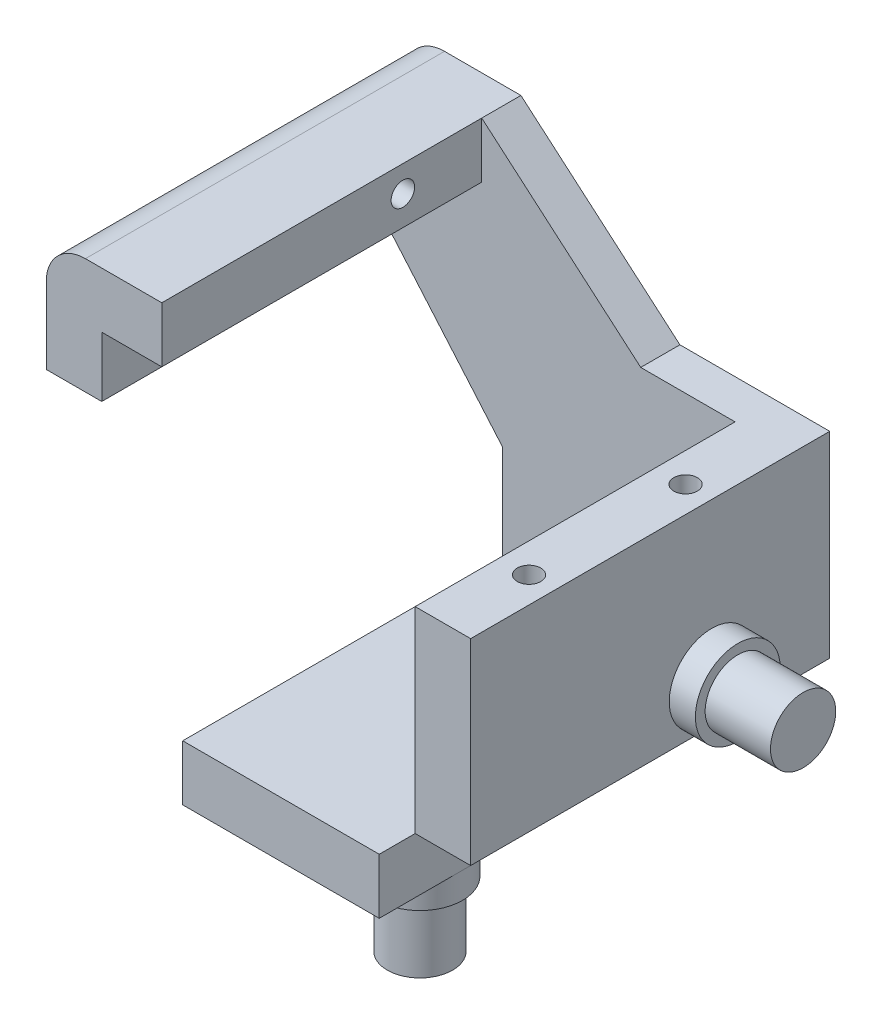
ISO-10303-21;
HEADER;
FILE_DESCRIPTION(('STEP AP214'),'2;1');
FILE_NAME('part.step','',(''),(''),'','','');
FILE_SCHEMA(('AUTOMOTIVE_DESIGN { 1 0 10303 214 1 1 1 1 }'));
ENDSEC;
DATA;
#1=APPLICATION_CONTEXT('core data for automotive mechanical design processes');
#2=APPLICATION_PROTOCOL_DEFINITION('international standard','automotive_design',2000,#1);
#3=PRODUCT_CONTEXT('',#1,'mechanical');
#4=PRODUCT('Part','Part','',(#3));
#5=PRODUCT_RELATED_PRODUCT_CATEGORY('part','',(#4));
#6=PRODUCT_DEFINITION_FORMATION('','',#4);
#7=PRODUCT_DEFINITION_CONTEXT('part definition',#1,'design');
#8=PRODUCT_DEFINITION('design','',#6,#7);
#9=PRODUCT_DEFINITION_SHAPE('','',#8);
#10=(LENGTH_UNIT() NAMED_UNIT(*) SI_UNIT(.MILLI.,.METRE.));
#11=(NAMED_UNIT(*) PLANE_ANGLE_UNIT() SI_UNIT($,.RADIAN.));
#12=(NAMED_UNIT(*) SI_UNIT($,.STERADIAN.) SOLID_ANGLE_UNIT());
#13=UNCERTAINTY_MEASURE_WITH_UNIT(LENGTH_MEASURE(1.E-05),#10,'distance_accuracy_value','');
#14=(GEOMETRIC_REPRESENTATION_CONTEXT(3) GLOBAL_UNCERTAINTY_ASSIGNED_CONTEXT((#13)) GLOBAL_UNIT_ASSIGNED_CONTEXT((#10,
#11,#12)) REPRESENTATION_CONTEXT('',''));
#15=CARTESIAN_POINT('',(0.,0.,0.));
#16=DIRECTION('',(0.,0.,1.));
#17=DIRECTION('',(1.,0.,0.));
#18=AXIS2_PLACEMENT_3D('',#15,#16,#17);
#19=CARTESIAN_POINT('',(-16.25,-16.25,27.5));
#20=DIRECTION('',(1.,0.,0.));
#21=DIRECTION('',(0.,0.,-1.));
#22=AXIS2_PLACEMENT_3D('',#19,#20,#21);
#23=PLANE('',#22);
#24=DIRECTION('',(0.,0.,1.));
#25=VECTOR('',#24,1.);
#26=CARTESIAN_POINT('',(-16.25,7.4,0.));
#27=LINE('',#26,#25);
#28=CARTESIAN_POINT('',(-16.25,7.4,0.));
#29=VERTEX_POINT('',#28);
#30=CARTESIAN_POINT('',(-16.25,7.4,3.));
#31=VERTEX_POINT('',#30);
#32=EDGE_CURVE('E167',#29,#31,#27,.T.);
#33=ORIENTED_EDGE('',*,*,#32,.T.);
#34=DIRECTION('',(0.,0.,1.));
#35=VECTOR('',#34,1.);
#36=CARTESIAN_POINT('',(-16.25,7.4,3.));
#37=LINE('',#36,#35);
#38=CARTESIAN_POINT('',(-16.25,7.4,27.5));
#39=VERTEX_POINT('',#38);
#40=EDGE_CURVE('E239',#31,#39,#37,.T.);
#41=ORIENTED_EDGE('',*,*,#40,.T.);
#42=DIRECTION('',(0.,-1.,0.));
#43=VECTOR('',#42,1.);
#44=CARTESIAN_POINT('',(-16.25,-16.25,27.5));
#45=LINE('',#44,#43);
#46=CARTESIAN_POINT('',(-16.25,13.25,27.5));
#47=VERTEX_POINT('',#46);
#48=EDGE_CURVE('E82',#47,#39,#45,.T.);
#49=ORIENTED_EDGE('',*,*,#48,.F.);
#50=DIRECTION('',(0.,0.,-1.));
#51=VECTOR('',#50,1.);
#52=CARTESIAN_POINT('',(-16.25,13.25,27.5));
#53=LINE('',#52,#51);
#54=CARTESIAN_POINT('',(-16.25,13.25,0.));
#55=VERTEX_POINT('',#54);
#56=EDGE_CURVE('E75',#47,#55,#53,.T.);
#57=ORIENTED_EDGE('',*,*,#56,.T.);
#58=DIRECTION('',(0.,-1.,0.));
#59=VECTOR('',#58,1.);
#60=CARTESIAN_POINT('',(-16.25,-16.25,0.));
#61=LINE('',#60,#59);
#62=EDGE_CURVE('E89',#55,#29,#61,.T.);
#63=ORIENTED_EDGE('',*,*,#62,.T.);
#64=EDGE_LOOP('',(#33,#41,#49,#57,#63));
#65=FACE_BOUND('',#64,.T.);
#66=ADVANCED_FACE('F34',(#65),#23,.F.);
#67=CARTESIAN_POINT('',(-16.25,-16.25,27.5));
#68=DIRECTION('',(0.,1.,0.));
#69=DIRECTION('',(0.,0.,1.));
#70=AXIS2_PLACEMENT_3D('',#67,#68,#69);
#71=PLANE('',#70);
#72=DIRECTION('',(0.,0.,1.));
#73=VECTOR('',#72,1.);
#74=CARTESIAN_POINT('',(-5.80000000000001,-16.25,3.));
#75=LINE('',#74,#73);
#76=CARTESIAN_POINT('',(-5.80000000000001,-16.25,0.));
#77=VERTEX_POINT('',#76);
#78=CARTESIAN_POINT('',(-5.80000000000001,-16.25,27.5));
#79=VERTEX_POINT('',#78);
#80=EDGE_CURVE('E228',#77,#79,#75,.T.);
#81=ORIENTED_EDGE('',*,*,#80,.F.);
#82=DIRECTION('',(1.,0.,0.));
#83=VECTOR('',#82,1.);
#84=CARTESIAN_POINT('',(-16.25,-16.25,0.));
#85=LINE('',#84,#83);
#86=CARTESIAN_POINT('',(9.25,-16.25,0.));
#87=VERTEX_POINT('',#86);
#88=EDGE_CURVE('E97',#77,#87,#85,.T.);
#89=ORIENTED_EDGE('',*,*,#88,.T.);
#90=DIRECTION('',(0.,0.,1.));
#91=VECTOR('',#90,1.);
#92=CARTESIAN_POINT('',(9.25,-16.25,0.));
#93=LINE('',#92,#91);
#94=CARTESIAN_POINT('',(9.25,-16.25,21.13));
#95=VERTEX_POINT('',#94);
#96=EDGE_CURVE('E205',#87,#95,#93,.T.);
#97=ORIENTED_EDGE('',*,*,#96,.T.);
#98=CARTESIAN_POINT('',(6.,-16.25,21.13));
#99=DIRECTION('',(0.,1.,0.));
#100=DIRECTION('',(0.,0.,1.));
#101=AXIS2_PLACEMENT_3D('',#98,#99,#100);
#102=CIRCLE('',#101,3.25);
#103=EDGE_CURVE('E113',#95,#95,#102,.F.);
#104=ORIENTED_EDGE('',*,*,#103,.F.);
#105=CARTESIAN_POINT('',(9.25,-16.25,27.5));
#106=VERTEX_POINT('',#105);
#107=EDGE_CURVE('E209',#95,#106,#93,.T.);
#108=ORIENTED_EDGE('',*,*,#107,.T.);
#109=DIRECTION('',(1.,0.,0.));
#110=VECTOR('',#109,1.);
#111=CARTESIAN_POINT('',(-16.25,-16.25,27.5));
#112=LINE('',#111,#110);
#113=EDGE_CURVE('E287',#79,#106,#112,.T.);
#114=ORIENTED_EDGE('',*,*,#113,.F.);
#115=EDGE_LOOP('',(#81,#89,#97,#104,#108,#114));
#116=FACE_BOUND('',#115,.T.);
#117=ADVANCED_FACE('F423',(#116),#71,.F.);
#118=CARTESIAN_POINT('',(-13.25,13.25,0.));
#119=DIRECTION('',(0.,0.,1.));
#120=DIRECTION('',(1.,0.,0.));
#121=AXIS2_PLACEMENT_3D('',#118,#119,#120);
#122=PLANE('',#121);
#123=DIRECTION('',(0.651281240201258,-0.758836442299598,0.));
#124=VECTOR('',#123,1.);
#125=CARTESIAN_POINT('',(-5.8,-4.77575500805203,0.));
#126=LINE('',#125,#124);
#127=CARTESIAN_POINT('',(-5.8,-4.77575500805203,0.));
#128=VERTEX_POINT('',#127);
#129=EDGE_CURVE('E96',#29,#128,#126,.T.);
#130=ORIENTED_EDGE('',*,*,#129,.F.);
#131=ORIENTED_EDGE('',*,*,#62,.F.);
#132=CARTESIAN_POINT('',(-13.25,13.25,0.));
#133=DIRECTION('',(0.,0.,1.));
#134=DIRECTION('',(1.,0.,0.));
#135=AXIS2_PLACEMENT_3D('',#132,#133,#134);
#136=CIRCLE('',#135,3.);
#137=CARTESIAN_POINT('',(-13.25,16.25,0.));
#138=VERTEX_POINT('',#137);
#139=EDGE_CURVE('E72',#138,#55,#136,.T.);
#140=ORIENTED_EDGE('',*,*,#139,.F.);
#141=DIRECTION('',(-1.,0.,0.));
#142=VECTOR('',#141,1.);
#143=CARTESIAN_POINT('',(-13.25,16.25,0.));
#144=LINE('',#143,#142);
#145=CARTESIAN_POINT('',(-7.4,16.25,0.));
#146=VERTEX_POINT('',#145);
#147=EDGE_CURVE('E83',#146,#138,#144,.T.);
#148=ORIENTED_EDGE('',*,*,#147,.F.);
#149=DIRECTION('',(0.758836442299598,-0.651281240201258,0.));
#150=VECTOR('',#149,1.);
#151=CARTESIAN_POINT('',(4.77575500805203,5.8,0.));
#152=LINE('',#151,#150);
#153=CARTESIAN_POINT('',(4.77575500805203,5.8,0.));
#154=VERTEX_POINT('',#153);
#155=EDGE_CURVE('E172',#146,#154,#152,.T.);
#156=ORIENTED_EDGE('',*,*,#155,.T.);
#157=DIRECTION('',(1.,0.,0.));
#158=VECTOR('',#157,1.);
#159=CARTESIAN_POINT('',(16.25,5.8,0.));
#160=LINE('',#159,#158);
#161=CARTESIAN_POINT('',(16.25,5.8,0.));
#162=VERTEX_POINT('',#161);
#163=EDGE_CURVE('E175',#154,#162,#160,.T.);
#164=ORIENTED_EDGE('',*,*,#163,.T.);
#165=DIRECTION('',(0.,1.,0.));
#166=VECTOR('',#165,1.);
#167=CARTESIAN_POINT('',(16.25,-16.25,0.));
#168=LINE('',#167,#166);
#169=CARTESIAN_POINT('',(16.25,-9.25,0.));
#170=VERTEX_POINT('',#169);
#171=EDGE_CURVE('E101',#170,#162,#168,.T.);
#172=ORIENTED_EDGE('',*,*,#171,.F.);
#173=DIRECTION('',(-1.,0.,0.));
#174=VECTOR('',#173,1.);
#175=CARTESIAN_POINT('',(16.25,-9.25,0.));
#176=LINE('',#175,#174);
#177=CARTESIAN_POINT('',(12.,-9.25,0.));
#178=VERTEX_POINT('',#177);
#179=EDGE_CURVE('E190',#170,#178,#176,.T.);
#180=ORIENTED_EDGE('',*,*,#179,.T.);
#181=CARTESIAN_POINT('',(12.,-12.,0.));
#182=DIRECTION('',(0.,0.,1.));
#183=DIRECTION('',(1.,0.,0.));
#184=AXIS2_PLACEMENT_3D('',#181,#182,#183);
#185=CIRCLE('',#184,2.75);
#186=CARTESIAN_POINT('',(9.25,-12.,0.));
#187=VERTEX_POINT('',#186);
#188=EDGE_CURVE('E193',#178,#187,#185,.T.);
#189=ORIENTED_EDGE('',*,*,#188,.T.);
#190=DIRECTION('',(0.,-1.,0.));
#191=VECTOR('',#190,1.);
#192=CARTESIAN_POINT('',(9.25,-16.25,0.));
#193=LINE('',#192,#191);
#194=EDGE_CURVE('E197',#187,#87,#193,.T.);
#195=ORIENTED_EDGE('',*,*,#194,.T.);
#196=ORIENTED_EDGE('',*,*,#88,.F.);
#197=DIRECTION('',(0.,-1.,0.));
#198=VECTOR('',#197,1.);
#199=CARTESIAN_POINT('',(-5.80000000000001,-16.25,0.));
#200=LINE('',#199,#198);
#201=EDGE_CURVE('E157',#128,#77,#200,.T.);
#202=ORIENTED_EDGE('',*,*,#201,.F.);
#203=EDGE_LOOP('',(#130,#131,#140,#148,#156,#164,#172,#180,#189,#195,#196,#202));
#204=FACE_BOUND('',#203,.T.);
#205=ADVANCED_FACE('F93',(#204),#122,.F.);
#206=CARTESIAN_POINT('',(0.,0.,3.));
#207=DIRECTION('',(0.,0.,-1.));
#208=DIRECTION('',(-1.,0.,0.));
#209=AXIS2_PLACEMENT_3D('',#206,#207,#208);
#210=PLANE('',#209);
#211=DIRECTION('',(0.651281240201258,-0.758836442299598,0.));
#212=VECTOR('',#211,1.);
#213=CARTESIAN_POINT('',(-5.8,-4.77575500805203,3.));
#214=LINE('',#213,#212);
#215=CARTESIAN_POINT('',(-5.8,-4.77575500805203,3.));
#216=VERTEX_POINT('',#215);
#217=EDGE_CURVE('E160',#31,#216,#214,.T.);
#218=ORIENTED_EDGE('',*,*,#217,.T.);
#219=DIRECTION('',(0.,-1.,0.));
#220=VECTOR('',#219,1.);
#221=CARTESIAN_POINT('',(-5.80000000000001,-16.25,3.));
#222=LINE('',#221,#220);
#223=CARTESIAN_POINT('',(-5.80000000000001,-12.,3.));
#224=VERTEX_POINT('',#223);
#225=EDGE_CURVE('E148',#216,#224,#222,.T.);
#226=ORIENTED_EDGE('',*,*,#225,.T.);
#227=DIRECTION('',(1.,0.,0.));
#228=VECTOR('',#227,1.);
#229=CARTESIAN_POINT('',(-12.,-12.,3.));
#230=LINE('',#229,#228);
#231=CARTESIAN_POINT('',(9.25,-12.,3.));
#232=VERTEX_POINT('',#231);
#233=EDGE_CURVE('E269',#224,#232,#230,.T.);
#234=ORIENTED_EDGE('',*,*,#233,.T.);
#235=CARTESIAN_POINT('',(12.,-12.,3.));
#236=DIRECTION('',(0.,0.,-1.));
#237=DIRECTION('',(-1.,0.,0.));
#238=AXIS2_PLACEMENT_3D('',#235,#236,#237);
#239=CIRCLE('',#238,2.75);
#240=CARTESIAN_POINT('',(12.,-9.25,3.));
#241=VERTEX_POINT('',#240);
#242=EDGE_CURVE('E37',#232,#241,#239,.T.);
#243=ORIENTED_EDGE('',*,*,#242,.T.);
#244=DIRECTION('',(0.,1.,0.));
#245=VECTOR('',#244,1.);
#246=CARTESIAN_POINT('',(12.,-12.,3.));
#247=LINE('',#246,#245);
#248=CARTESIAN_POINT('',(12.,5.8,3.));
#249=VERTEX_POINT('',#248);
#250=EDGE_CURVE('E272',#241,#249,#247,.T.);
#251=ORIENTED_EDGE('',*,*,#250,.T.);
#252=DIRECTION('',(1.,0.,0.));
#253=VECTOR('',#252,1.);
#254=CARTESIAN_POINT('',(16.25,5.8,3.));
#255=LINE('',#254,#253);
#256=CARTESIAN_POINT('',(4.77575500805203,5.8,3.));
#257=VERTEX_POINT('',#256);
#258=EDGE_CURVE('E176',#257,#249,#255,.T.);
#259=ORIENTED_EDGE('',*,*,#258,.F.);
#260=DIRECTION('',(0.758836442299598,-0.651281240201258,0.));
#261=VECTOR('',#260,1.);
#262=CARTESIAN_POINT('',(4.77575500805203,5.8,3.));
#263=LINE('',#262,#261);
#264=CARTESIAN_POINT('',(-7.4,16.25,3.));
#265=VERTEX_POINT('',#264);
#266=EDGE_CURVE('E169',#265,#257,#263,.T.);
#267=ORIENTED_EDGE('',*,*,#266,.F.);
#268=DIRECTION('',(0.,-1.,0.));
#269=VECTOR('',#268,1.);
#270=CARTESIAN_POINT('',(-7.4,16.25,3.));
#271=LINE('',#270,#269);
#272=CARTESIAN_POINT('',(-7.4,12.,3.));
#273=VERTEX_POINT('',#272);
#274=EDGE_CURVE('E245',#265,#273,#271,.T.);
#275=ORIENTED_EDGE('',*,*,#274,.T.);
#276=DIRECTION('',(-1.,0.,0.));
#277=VECTOR('',#276,1.);
#278=CARTESIAN_POINT('',(-12.,12.,3.));
#279=LINE('',#278,#277);
#280=CARTESIAN_POINT('',(-12.,12.,3.));
#281=VERTEX_POINT('',#280);
#282=EDGE_CURVE('E104',#273,#281,#279,.T.);
#283=ORIENTED_EDGE('',*,*,#282,.T.);
#284=DIRECTION('',(0.,-1.,0.));
#285=VECTOR('',#284,1.);
#286=CARTESIAN_POINT('',(-12.,-12.,3.));
#287=LINE('',#286,#285);
#288=CARTESIAN_POINT('',(-12.,7.4,3.));
#289=VERTEX_POINT('',#288);
#290=EDGE_CURVE('E266',#281,#289,#287,.T.);
#291=ORIENTED_EDGE('',*,*,#290,.T.);
#292=DIRECTION('',(1.,0.,0.));
#293=VECTOR('',#292,1.);
#294=CARTESIAN_POINT('',(-16.25,7.4,3.));
#295=LINE('',#294,#293);
#296=EDGE_CURVE('E225',#31,#289,#295,.T.);
#297=ORIENTED_EDGE('',*,*,#296,.F.);
#298=EDGE_LOOP('',(#218,#226,#234,#243,#251,#259,#267,#275,#283,#291,#297));
#299=FACE_BOUND('',#298,.T.);
#300=ADVANCED_FACE('F401',(#299),#210,.F.);
#301=CARTESIAN_POINT('',(-13.25,13.25,27.5));
#302=DIRECTION('',(0.,0.,1.));
#303=DIRECTION('',(1.,0.,0.));
#304=AXIS2_PLACEMENT_3D('',#301,#302,#303);
#305=PLANE('',#304);
#306=DIRECTION('',(0.,-1.,0.));
#307=VECTOR('',#306,1.);
#308=CARTESIAN_POINT('',(9.25,-16.25,27.5));
#309=LINE('',#308,#307);
#310=CARTESIAN_POINT('',(9.25,-12.,27.5));
#311=VERTEX_POINT('',#310);
#312=EDGE_CURVE('E194',#311,#106,#309,.T.);
#313=ORIENTED_EDGE('',*,*,#312,.F.);
#314=DIRECTION('',(1.,0.,0.));
#315=VECTOR('',#314,1.);
#316=CARTESIAN_POINT('',(-12.,-12.,27.5));
#317=LINE('',#316,#315);
#318=CARTESIAN_POINT('',(-5.80000000000001,-12.,27.5));
#319=VERTEX_POINT('',#318);
#320=EDGE_CURVE('E278',#319,#311,#317,.T.);
#321=ORIENTED_EDGE('',*,*,#320,.F.);
#322=DIRECTION('',(0.,1.,0.));
#323=VECTOR('',#322,1.);
#324=CARTESIAN_POINT('',(-5.80000000000001,-16.25,27.5));
#325=LINE('',#324,#323);
#326=EDGE_CURVE('E229',#79,#319,#325,.T.);
#327=ORIENTED_EDGE('',*,*,#326,.F.);
#328=ORIENTED_EDGE('',*,*,#113,.T.);
#329=EDGE_LOOP('',(#313,#321,#327,#328));
#330=FACE_BOUND('',#329,.T.);
#331=ADVANCED_FACE('F447',(#330),#305,.T.);
#332=ORIENTED_EDGE('',*,*,#48,.T.);
#333=DIRECTION('',(1.,0.,0.));
#334=VECTOR('',#333,1.);
#335=CARTESIAN_POINT('',(-16.25,7.4,27.5));
#336=LINE('',#335,#334);
#337=CARTESIAN_POINT('',(-12.,7.4,27.5));
#338=VERTEX_POINT('',#337);
#339=EDGE_CURVE('E224',#39,#338,#336,.T.);
#340=ORIENTED_EDGE('',*,*,#339,.T.);
#341=DIRECTION('',(0.,-1.,0.));
#342=VECTOR('',#341,1.);
#343=CARTESIAN_POINT('',(-12.,-12.,27.5));
#344=LINE('',#343,#342);
#345=CARTESIAN_POINT('',(-12.,12.,27.5));
#346=VERTEX_POINT('',#345);
#347=EDGE_CURVE('E265',#346,#338,#344,.T.);
#348=ORIENTED_EDGE('',*,*,#347,.F.);
#349=DIRECTION('',(-1.,0.,0.));
#350=VECTOR('',#349,1.);
#351=CARTESIAN_POINT('',(-12.,12.,27.5));
#352=LINE('',#351,#350);
#353=CARTESIAN_POINT('',(-7.4,12.,27.5));
#354=VERTEX_POINT('',#353);
#355=EDGE_CURVE('E270',#354,#346,#352,.T.);
#356=ORIENTED_EDGE('',*,*,#355,.F.);
#357=DIRECTION('',(0.,-1.,0.));
#358=VECTOR('',#357,1.);
#359=CARTESIAN_POINT('',(-7.4,16.25,27.5));
#360=LINE('',#359,#358);
#361=CARTESIAN_POINT('',(-7.4,16.25,27.5));
#362=VERTEX_POINT('',#361);
#363=EDGE_CURVE('E249',#362,#354,#360,.T.);
#364=ORIENTED_EDGE('',*,*,#363,.F.);
#365=DIRECTION('',(-1.,0.,0.));
#366=VECTOR('',#365,1.);
#367=CARTESIAN_POINT('',(-13.25,16.25,27.5));
#368=LINE('',#367,#366);
#369=CARTESIAN_POINT('',(-13.25,16.25,27.5));
#370=VERTEX_POINT('',#369);
#371=EDGE_CURVE('E292',#362,#370,#368,.T.);
#372=ORIENTED_EDGE('',*,*,#371,.T.);
#373=CARTESIAN_POINT('',(-13.25,13.25,27.5));
#374=DIRECTION('',(0.,0.,1.));
#375=DIRECTION('',(1.,0.,0.));
#376=AXIS2_PLACEMENT_3D('',#373,#374,#375);
#377=CIRCLE('',#376,3.);
#378=EDGE_CURVE('E59',#370,#47,#377,.T.);
#379=ORIENTED_EDGE('',*,*,#378,.T.);
#380=EDGE_LOOP('',(#332,#340,#348,#356,#364,#372,#379));
#381=FACE_BOUND('',#380,.T.);
#382=ADVANCED_FACE('F295',(#381),#305,.T.);
#383=CARTESIAN_POINT('',(-12.,-12.,3.));
#384=DIRECTION('',(-1.,0.,0.));
#385=DIRECTION('',(0.,0.,1.));
#386=AXIS2_PLACEMENT_3D('',#383,#384,#385);
#387=PLANE('',#386);
#388=DIRECTION('',(0.,0.,1.));
#389=VECTOR('',#388,1.);
#390=CARTESIAN_POINT('',(-12.,7.4,3.));
#391=LINE('',#390,#389);
#392=EDGE_CURVE('E236',#289,#338,#391,.T.);
#393=ORIENTED_EDGE('',*,*,#392,.F.);
#394=ORIENTED_EDGE('',*,*,#290,.F.);
#395=DIRECTION('',(0.,0.,1.));
#396=VECTOR('',#395,1.);
#397=CARTESIAN_POINT('',(-12.,12.,3.));
#398=LINE('',#397,#396);
#399=EDGE_CURVE('E98',#281,#346,#398,.T.);
#400=ORIENTED_EDGE('',*,*,#399,.T.);
#401=ORIENTED_EDGE('',*,*,#347,.T.);
#402=EDGE_LOOP('',(#393,#394,#400,#401));
#403=FACE_BOUND('',#402,.T.);
#404=ADVANCED_FACE('F378',(#403),#387,.F.);
#405=CARTESIAN_POINT('',(16.25,-16.25,27.5));
#406=DIRECTION('',(-1.,0.,0.));
#407=DIRECTION('',(0.,0.,1.));
#408=AXIS2_PLACEMENT_3D('',#405,#406,#407);
#409=PLANE('',#408);
#410=ORIENTED_EDGE('',*,*,#171,.T.);
#411=DIRECTION('',(0.,0.,1.));
#412=VECTOR('',#411,1.);
#413=CARTESIAN_POINT('',(16.25,5.8,3.));
#414=LINE('',#413,#412);
#415=CARTESIAN_POINT('',(16.25,5.8,27.5));
#416=VERTEX_POINT('',#415);
#417=EDGE_CURVE('E259',#162,#416,#414,.T.);
#418=ORIENTED_EDGE('',*,*,#417,.T.);
#419=DIRECTION('',(0.,1.,0.));
#420=VECTOR('',#419,1.);
#421=CARTESIAN_POINT('',(16.25,-16.25,27.5));
#422=LINE('',#421,#420);
#423=CARTESIAN_POINT('',(16.25,-9.25,27.5));
#424=VERTEX_POINT('',#423);
#425=EDGE_CURVE('E290',#424,#416,#422,.T.);
#426=ORIENTED_EDGE('',*,*,#425,.F.);
#427=DIRECTION('',(0.,0.,1.));
#428=VECTOR('',#427,1.);
#429=CARTESIAN_POINT('',(16.25,-9.25,0.));
#430=LINE('',#429,#428);
#431=CARTESIAN_POINT('',(16.25,-9.25,9.04));
#432=VERTEX_POINT('',#431);
#433=EDGE_CURVE('E200',#432,#424,#430,.T.);
#434=ORIENTED_EDGE('',*,*,#433,.F.);
#435=CARTESIAN_POINT('',(16.25,-6.,9.04));
#436=DIRECTION('',(-1.,0.,0.));
#437=DIRECTION('',(0.,0.,1.));
#438=AXIS2_PLACEMENT_3D('',#435,#436,#437);
#439=CIRCLE('',#438,3.25);
#440=EDGE_CURVE('E115',#432,#432,#439,.F.);
#441=ORIENTED_EDGE('',*,*,#440,.F.);
#442=EDGE_CURVE('E216',#170,#432,#430,.T.);
#443=ORIENTED_EDGE('',*,*,#442,.F.);
#444=EDGE_LOOP('',(#410,#418,#426,#434,#441,#443));
#445=FACE_BOUND('',#444,.T.);
#446=ADVANCED_FACE('F434',(#445),#409,.F.);
#447=DIRECTION('',(-1.,0.,0.));
#448=VECTOR('',#447,1.);
#449=CARTESIAN_POINT('',(16.25,-9.25,27.5));
#450=LINE('',#449,#448);
#451=CARTESIAN_POINT('',(12.,-9.25,27.5));
#452=VERTEX_POINT('',#451);
#453=EDGE_CURVE('E187',#424,#452,#450,.T.);
#454=ORIENTED_EDGE('',*,*,#453,.F.);
#455=ORIENTED_EDGE('',*,*,#425,.T.);
#456=DIRECTION('',(-1.,0.,0.));
#457=VECTOR('',#456,1.);
#458=CARTESIAN_POINT('',(16.25,5.8,27.5));
#459=LINE('',#458,#457);
#460=CARTESIAN_POINT('',(12.,5.8,27.5));
#461=VERTEX_POINT('',#460);
#462=EDGE_CURVE('E244',#416,#461,#459,.T.);
#463=ORIENTED_EDGE('',*,*,#462,.T.);
#464=DIRECTION('',(0.,1.,0.));
#465=VECTOR('',#464,1.);
#466=CARTESIAN_POINT('',(12.,-12.,27.5));
#467=LINE('',#466,#465);
#468=EDGE_CURVE('E281',#452,#461,#467,.T.);
#469=ORIENTED_EDGE('',*,*,#468,.F.);
#470=EDGE_LOOP('',(#454,#455,#463,#469));
#471=FACE_BOUND('',#470,.T.);
#472=ADVANCED_FACE('F437',(#471),#305,.T.);
#473=CARTESIAN_POINT('',(12.,-12.,3.));
#474=DIRECTION('',(1.,0.,0.));
#475=DIRECTION('',(0.,0.,-1.));
#476=AXIS2_PLACEMENT_3D('',#473,#474,#475);
#477=PLANE('',#476);
#478=ORIENTED_EDGE('',*,*,#250,.F.);
#479=DIRECTION('',(0.,0.,1.));
#480=VECTOR('',#479,1.);
#481=CARTESIAN_POINT('',(12.,-9.25,0.));
#482=LINE('',#481,#480);
#483=EDGE_CURVE('E215',#241,#452,#482,.T.);
#484=ORIENTED_EDGE('',*,*,#483,.T.);
#485=ORIENTED_EDGE('',*,*,#468,.T.);
#486=DIRECTION('',(0.,0.,1.));
#487=VECTOR('',#486,1.);
#488=CARTESIAN_POINT('',(12.,5.8,3.));
#489=LINE('',#488,#487);
#490=EDGE_CURVE('E262',#249,#461,#489,.T.);
#491=ORIENTED_EDGE('',*,*,#490,.F.);
#492=EDGE_LOOP('',(#478,#484,#485,#491));
#493=FACE_BOUND('',#492,.T.);
#494=ADVANCED_FACE('F441',(#493),#477,.F.);
#495=CARTESIAN_POINT('',(-13.25,16.25,27.5));
#496=DIRECTION('',(0.,-1.,0.));
#497=DIRECTION('',(0.,0.,-1.));
#498=AXIS2_PLACEMENT_3D('',#495,#496,#497);
#499=PLANE('',#498);
#500=DIRECTION('',(0.,0.,1.));
#501=VECTOR('',#500,1.);
#502=CARTESIAN_POINT('',(-7.4,16.25,3.));
#503=LINE('',#502,#501);
#504=EDGE_CURVE('E248',#265,#362,#503,.T.);
#505=ORIENTED_EDGE('',*,*,#504,.F.);
#506=DIRECTION('',(0.,0.,1.));
#507=VECTOR('',#506,1.);
#508=CARTESIAN_POINT('',(-7.4,16.25,0.));
#509=LINE('',#508,#507);
#510=EDGE_CURVE('E179',#146,#265,#509,.T.);
#511=ORIENTED_EDGE('',*,*,#510,.F.);
#512=ORIENTED_EDGE('',*,*,#147,.T.);
#513=DIRECTION('',(0.,0.,-1.));
#514=VECTOR('',#513,1.);
#515=CARTESIAN_POINT('',(-13.25,16.25,27.5));
#516=LINE('',#515,#514);
#517=EDGE_CURVE('E78',#370,#138,#516,.T.);
#518=ORIENTED_EDGE('',*,*,#517,.F.);
#519=ORIENTED_EDGE('',*,*,#371,.F.);
#520=EDGE_LOOP('',(#505,#511,#512,#518,#519));
#521=FACE_BOUND('',#520,.T.);
#522=ADVANCED_FACE('F300',(#521),#499,.F.);
#523=CARTESIAN_POINT('',(-13.25,13.25,27.5));
#524=DIRECTION('',(0.,0.,-1.));
#525=DIRECTION('',(-1.,0.,0.));
#526=AXIS2_PLACEMENT_3D('',#523,#524,#525);
#527=CYLINDRICAL_SURFACE('',#526,3.);
#528=ORIENTED_EDGE('',*,*,#139,.T.);
#529=ORIENTED_EDGE('',*,*,#56,.F.);
#530=ORIENTED_EDGE('',*,*,#378,.F.);
#531=ORIENTED_EDGE('',*,*,#517,.T.);
#532=EDGE_LOOP('',(#528,#529,#530,#531));
#533=FACE_BOUND('',#532,.T.);
#534=ADVANCED_FACE('F74',(#533),#527,.T.);
#535=CARTESIAN_POINT('',(-12.,12.,3.));
#536=DIRECTION('',(0.,1.,0.));
#537=DIRECTION('',(0.,0.,1.));
#538=AXIS2_PLACEMENT_3D('',#535,#536,#537);
#539=PLANE('',#538);
#540=ORIENTED_EDGE('',*,*,#282,.F.);
#541=DIRECTION('',(0.,0.,1.));
#542=VECTOR('',#541,1.);
#543=CARTESIAN_POINT('',(-7.4,12.,3.));
#544=LINE('',#543,#542);
#545=EDGE_CURVE('E256',#273,#354,#544,.T.);
#546=ORIENTED_EDGE('',*,*,#545,.T.);
#547=ORIENTED_EDGE('',*,*,#355,.T.);
#548=ORIENTED_EDGE('',*,*,#399,.F.);
#549=EDGE_LOOP('',(#540,#546,#547,#548));
#550=FACE_BOUND('',#549,.T.);
#551=ADVANCED_FACE('F373',(#550),#539,.F.);
#552=CARTESIAN_POINT('',(-12.,-12.,3.));
#553=DIRECTION('',(0.,-1.,0.));
#554=DIRECTION('',(0.,0.,-1.));
#555=AXIS2_PLACEMENT_3D('',#552,#553,#554);
#556=PLANE('',#555);
#557=ORIENTED_EDGE('',*,*,#320,.T.);
#558=DIRECTION('',(0.,0.,1.));
#559=VECTOR('',#558,1.);
#560=CARTESIAN_POINT('',(9.25,-12.,0.));
#561=LINE('',#560,#559);
#562=EDGE_CURVE('E213',#232,#311,#561,.T.);
#563=ORIENTED_EDGE('',*,*,#562,.F.);
#564=ORIENTED_EDGE('',*,*,#233,.F.);
#565=DIRECTION('',(0.,0.,1.));
#566=VECTOR('',#565,1.);
#567=CARTESIAN_POINT('',(-5.80000000000001,-12.,3.));
#568=LINE('',#567,#566);
#569=EDGE_CURVE('E241',#224,#319,#568,.T.);
#570=ORIENTED_EDGE('',*,*,#569,.T.);
#571=EDGE_LOOP('',(#557,#563,#564,#570));
#572=FACE_BOUND('',#571,.T.);
#573=ADVANCED_FACE('F417',(#572),#556,.F.);
#574=CARTESIAN_POINT('',(16.25,5.8,3.));
#575=DIRECTION('',(0.,1.,0.));
#576=DIRECTION('',(-1.,0.,0.));
#577=AXIS2_PLACEMENT_3D('',#574,#575,#576);
#578=PLANE('',#577);
#579=CARTESIAN_POINT('',(14.25,5.8,9.04));
#580=DIRECTION('',(0.,1.,0.));
#581=DIRECTION('',(-1.,0.,0.));
#582=AXIS2_PLACEMENT_3D('',#579,#580,#581);
#583=CIRCLE('',#582,0.9);
#584=CARTESIAN_POINT('',(13.35,5.8,9.04));
#585=VERTEX_POINT('',#584);
#586=EDGE_CURVE('E149',#585,#585,#583,.T.);
#587=ORIENTED_EDGE('',*,*,#586,.F.);
#588=EDGE_LOOP('',(#587));
#589=FACE_BOUND('',#588,.T.);
#590=CARTESIAN_POINT('',(14.25,5.8,21.03));
#591=DIRECTION('',(0.,1.,0.));
#592=DIRECTION('',(-1.,0.,0.));
#593=AXIS2_PLACEMENT_3D('',#590,#591,#592);
#594=CIRCLE('',#593,0.900000000000001);
#595=CARTESIAN_POINT('',(13.35,5.8,21.03));
#596=VERTEX_POINT('',#595);
#597=EDGE_CURVE('E152',#596,#596,#594,.T.);
#598=ORIENTED_EDGE('',*,*,#597,.F.);
#599=EDGE_LOOP('',(#598));
#600=FACE_BOUND('',#599,.T.);
#601=ORIENTED_EDGE('',*,*,#490,.T.);
#602=ORIENTED_EDGE('',*,*,#462,.F.);
#603=ORIENTED_EDGE('',*,*,#417,.F.);
#604=ORIENTED_EDGE('',*,*,#163,.F.);
#605=DIRECTION('',(0.,0.,1.));
#606=VECTOR('',#605,1.);
#607=CARTESIAN_POINT('',(4.77575500805203,5.8,0.));
#608=LINE('',#607,#606);
#609=EDGE_CURVE('E184',#154,#257,#608,.T.);
#610=ORIENTED_EDGE('',*,*,#609,.T.);
#611=ORIENTED_EDGE('',*,*,#258,.T.);
#612=EDGE_LOOP('',(#601,#602,#603,#604,#610,#611));
#613=FACE_BOUND('',#612,.T.);
#614=ADVANCED_FACE('F408',(#589,#600,#613),#578,.T.);
#615=CARTESIAN_POINT('',(-7.4,16.25,3.));
#616=DIRECTION('',(-1.,0.,0.));
#617=DIRECTION('',(0.,0.,1.));
#618=AXIS2_PLACEMENT_3D('',#615,#616,#617);
#619=PLANE('',#618);
#620=CARTESIAN_POINT('',(-7.4,14.25,9.04));
#621=DIRECTION('',(1.,0.,0.));
#622=DIRECTION('',(0.,0.,-1.));
#623=AXIS2_PLACEMENT_3D('',#620,#621,#622);
#624=CIRCLE('',#623,0.9);
#625=CARTESIAN_POINT('',(-7.4,14.25,8.14));
#626=VERTEX_POINT('',#625);
#627=EDGE_CURVE('E532',#626,#626,#624,.T.);
#628=ORIENTED_EDGE('',*,*,#627,.F.);
#629=EDGE_LOOP('',(#628));
#630=FACE_BOUND('',#629,.T.);
#631=ORIENTED_EDGE('',*,*,#363,.T.);
#632=ORIENTED_EDGE('',*,*,#545,.F.);
#633=ORIENTED_EDGE('',*,*,#274,.F.);
#634=ORIENTED_EDGE('',*,*,#504,.T.);
#635=EDGE_LOOP('',(#631,#632,#633,#634));
#636=FACE_BOUND('',#635,.T.);
#637=ADVANCED_FACE('F406',(#630,#636),#619,.F.);
#638=CARTESIAN_POINT('',(-5.80000000000001,-16.25,3.));
#639=DIRECTION('',(1.,0.,0.));
#640=DIRECTION('',(0.,1.,0.));
#641=AXIS2_PLACEMENT_3D('',#638,#639,#640);
#642=PLANE('',#641);
#643=CARTESIAN_POINT('',(-5.80000000000001,-14.25,9.04));
#644=DIRECTION('',(1.,0.,0.));
#645=DIRECTION('',(0.,1.,0.));
#646=AXIS2_PLACEMENT_3D('',#643,#644,#645);
#647=CIRCLE('',#646,0.9);
#648=CARTESIAN_POINT('',(-5.80000000000001,-13.35,9.04));
#649=VERTEX_POINT('',#648);
#650=EDGE_CURVE('E136',#649,#649,#647,.T.);
#651=ORIENTED_EDGE('',*,*,#650,.T.);
#652=EDGE_LOOP('',(#651));
#653=FACE_BOUND('',#652,.T.);
#654=CARTESIAN_POINT('',(-5.80000000000001,-14.25,21.03));
#655=DIRECTION('',(1.,0.,0.));
#656=DIRECTION('',(0.,1.,0.));
#657=AXIS2_PLACEMENT_3D('',#654,#655,#656);
#658=CIRCLE('',#657,0.900000000000001);
#659=CARTESIAN_POINT('',(-5.80000000000001,-13.35,21.03));
#660=VERTEX_POINT('',#659);
#661=EDGE_CURVE('E142',#660,#660,#658,.T.);
#662=ORIENTED_EDGE('',*,*,#661,.T.);
#663=EDGE_LOOP('',(#662));
#664=FACE_BOUND('',#663,.T.);
#665=ORIENTED_EDGE('',*,*,#569,.F.);
#666=ORIENTED_EDGE('',*,*,#225,.F.);
#667=DIRECTION('',(0.,0.,1.));
#668=VECTOR('',#667,1.);
#669=CARTESIAN_POINT('',(-5.8,-4.77575500805203,0.));
#670=LINE('',#669,#668);
#671=EDGE_CURVE('E162',#128,#216,#670,.T.);
#672=ORIENTED_EDGE('',*,*,#671,.F.);
#673=ORIENTED_EDGE('',*,*,#201,.T.);
#674=ORIENTED_EDGE('',*,*,#80,.T.);
#675=ORIENTED_EDGE('',*,*,#326,.T.);
#676=EDGE_LOOP('',(#665,#666,#672,#673,#674,#675));
#677=FACE_BOUND('',#676,.T.);
#678=ADVANCED_FACE('F399',(#653,#664,#677),#642,.F.);
#679=CARTESIAN_POINT('',(-16.25,7.4,3.));
#680=DIRECTION('',(0.,-1.,0.));
#681=DIRECTION('',(1.,0.,0.));
#682=AXIS2_PLACEMENT_3D('',#679,#680,#681);
#683=PLANE('',#682);
#684=CARTESIAN_POINT('',(-14.25,7.4,21.03));
#685=DIRECTION('',(0.,-1.,0.));
#686=DIRECTION('',(1.,0.,0.));
#687=AXIS2_PLACEMENT_3D('',#684,#685,#686);
#688=CIRCLE('',#687,0.900000000000002);
#689=CARTESIAN_POINT('',(-13.35,7.4,21.03));
#690=VERTEX_POINT('',#689);
#691=EDGE_CURVE('E527',#690,#690,#688,.T.);
#692=ORIENTED_EDGE('',*,*,#691,.F.);
#693=EDGE_LOOP('',(#692));
#694=FACE_BOUND('',#693,.T.);
#695=ORIENTED_EDGE('',*,*,#339,.F.);
#696=ORIENTED_EDGE('',*,*,#40,.F.);
#697=ORIENTED_EDGE('',*,*,#296,.T.);
#698=ORIENTED_EDGE('',*,*,#392,.T.);
#699=EDGE_LOOP('',(#695,#696,#697,#698));
#700=FACE_BOUND('',#699,.T.);
#701=ADVANCED_FACE('F381',(#694,#700),#683,.T.);
#702=CARTESIAN_POINT('',(6.,-18.25,21.13));
#703=DIRECTION('',(0.,1.,0.));
#704=DIRECTION('',(0.,0.,1.));
#705=AXIS2_PLACEMENT_3D('',#702,#703,#704);
#706=CYLINDRICAL_SURFACE('',#705,3.25);
#707=CARTESIAN_POINT('',(6.,-18.25,21.13));
#708=DIRECTION('',(0.,-1.,0.));
#709=DIRECTION('',(0.,0.,-1.));
#710=AXIS2_PLACEMENT_3D('',#707,#708,#709);
#711=CIRCLE('',#710,3.25);
#712=CARTESIAN_POINT('',(6.,-18.25,17.88));
#713=VERTEX_POINT('',#712);
#714=EDGE_CURVE('E221',#713,#713,#711,.T.);
#715=ORIENTED_EDGE('',*,*,#714,.F.);
#716=EDGE_LOOP('',(#715));
#717=FACE_BOUND('',#716,.T.);
#718=ORIENTED_EDGE('',*,*,#103,.T.);
#719=EDGE_LOOP('',(#718));
#720=FACE_BOUND('',#719,.T.);
#721=ADVANCED_FACE('F517',(#717,#720),#706,.T.);
#722=CARTESIAN_POINT('',(6.,-18.25,21.13));
#723=DIRECTION('',(0.,-1.,0.));
#724=DIRECTION('',(0.,0.,-1.));
#725=AXIS2_PLACEMENT_3D('',#722,#723,#724);
#726=PLANE('',#725);
#727=CARTESIAN_POINT('',(6.,-18.25,21.13));
#728=DIRECTION('',(0.,-1.,0.));
#729=DIRECTION('',(0.,0.,-1.));
#730=AXIS2_PLACEMENT_3D('',#727,#728,#729);
#731=CIRCLE('',#730,2.5);
#732=CARTESIAN_POINT('',(6.,-18.25,18.63));
#733=VERTEX_POINT('',#732);
#734=EDGE_CURVE('E42',#733,#733,#731,.T.);
#735=ORIENTED_EDGE('',*,*,#734,.F.);
#736=EDGE_LOOP('',(#735));
#737=FACE_BOUND('',#736,.T.);
#738=ORIENTED_EDGE('',*,*,#714,.T.);
#739=EDGE_LOOP('',(#738));
#740=FACE_BOUND('',#739,.T.);
#741=ADVANCED_FACE('F513',(#737,#740),#726,.T.);
#742=CARTESIAN_POINT('',(18.25,-6.,9.04));
#743=DIRECTION('',(-1.,0.,0.));
#744=DIRECTION('',(0.,0.,1.));
#745=AXIS2_PLACEMENT_3D('',#742,#743,#744);
#746=CYLINDRICAL_SURFACE('',#745,3.25);
#747=CARTESIAN_POINT('',(18.25,-6.,9.04));
#748=DIRECTION('',(1.,0.,0.));
#749=DIRECTION('',(0.,0.,-1.));
#750=AXIS2_PLACEMENT_3D('',#747,#748,#749);
#751=CIRCLE('',#750,3.25);
#752=CARTESIAN_POINT('',(18.25,-6.,5.79));
#753=VERTEX_POINT('',#752);
#754=EDGE_CURVE('E208',#753,#753,#751,.T.);
#755=ORIENTED_EDGE('',*,*,#754,.F.);
#756=EDGE_LOOP('',(#755));
#757=FACE_BOUND('',#756,.T.);
#758=ORIENTED_EDGE('',*,*,#440,.T.);
#759=EDGE_LOOP('',(#758));
#760=FACE_BOUND('',#759,.T.);
#761=ADVANCED_FACE('F509',(#757,#760),#746,.T.);
#762=CARTESIAN_POINT('',(18.25,-6.,9.04));
#763=DIRECTION('',(1.,0.,0.));
#764=DIRECTION('',(0.,0.,-1.));
#765=AXIS2_PLACEMENT_3D('',#762,#763,#764);
#766=PLANE('',#765);
#767=CARTESIAN_POINT('',(18.25,-6.,9.04));
#768=DIRECTION('',(1.,0.,0.));
#769=DIRECTION('',(0.,0.,-1.));
#770=AXIS2_PLACEMENT_3D('',#767,#768,#769);
#771=CIRCLE('',#770,2.5);
#772=CARTESIAN_POINT('',(18.25,-6.,6.54));
#773=VERTEX_POINT('',#772);
#774=EDGE_CURVE('E11',#773,#773,#771,.T.);
#775=ORIENTED_EDGE('',*,*,#774,.F.);
#776=EDGE_LOOP('',(#775));
#777=FACE_BOUND('',#776,.T.);
#778=ORIENTED_EDGE('',*,*,#754,.T.);
#779=EDGE_LOOP('',(#778));
#780=FACE_BOUND('',#779,.T.);
#781=ADVANCED_FACE('F505',(#777,#780),#766,.T.);
#782=CARTESIAN_POINT('',(12.,-12.,0.));
#783=DIRECTION('',(0.,0.,1.));
#784=DIRECTION('',(1.,0.,0.));
#785=AXIS2_PLACEMENT_3D('',#782,#783,#784);
#786=CYLINDRICAL_SURFACE('',#785,2.75);
#787=EDGE_CURVE('E210',#187,#232,#561,.T.);
#788=ORIENTED_EDGE('',*,*,#787,.F.);
#789=ORIENTED_EDGE('',*,*,#188,.F.);
#790=EDGE_CURVE('E50',#178,#241,#482,.T.);
#791=ORIENTED_EDGE('',*,*,#790,.T.);
#792=ORIENTED_EDGE('',*,*,#242,.F.);
#793=EDGE_LOOP('',(#788,#789,#791,#792));
#794=FACE_BOUND('',#793,.T.);
#795=ADVANCED_FACE('F476',(#794),#786,.F.);
#796=CARTESIAN_POINT('',(9.25,-16.25,0.));
#797=DIRECTION('',(-1.,0.,0.));
#798=DIRECTION('',(0.,0.,1.));
#799=AXIS2_PLACEMENT_3D('',#796,#797,#798);
#800=PLANE('',#799);
#801=ORIENTED_EDGE('',*,*,#312,.T.);
#802=ORIENTED_EDGE('',*,*,#107,.F.);
#803=ORIENTED_EDGE('',*,*,#96,.F.);
#804=ORIENTED_EDGE('',*,*,#194,.F.);
#805=ORIENTED_EDGE('',*,*,#787,.T.);
#806=ORIENTED_EDGE('',*,*,#562,.T.);
#807=EDGE_LOOP('',(#801,#802,#803,#804,#805,#806));
#808=FACE_BOUND('',#807,.T.);
#809=ADVANCED_FACE('F473',(#808),#800,.F.);
#810=CARTESIAN_POINT('',(16.25,-9.25,0.));
#811=DIRECTION('',(0.,1.,0.));
#812=DIRECTION('',(-1.,0.,0.));
#813=AXIS2_PLACEMENT_3D('',#810,#811,#812);
#814=PLANE('',#813);
#815=ORIENTED_EDGE('',*,*,#453,.T.);
#816=ORIENTED_EDGE('',*,*,#483,.F.);
#817=ORIENTED_EDGE('',*,*,#790,.F.);
#818=ORIENTED_EDGE('',*,*,#179,.F.);
#819=ORIENTED_EDGE('',*,*,#442,.T.);
#820=ORIENTED_EDGE('',*,*,#433,.T.);
#821=EDGE_LOOP('',(#815,#816,#817,#818,#819,#820));
#822=FACE_BOUND('',#821,.T.);
#823=ADVANCED_FACE('F480',(#822),#814,.F.);
#824=CARTESIAN_POINT('',(4.77575500805203,5.8,0.));
#825=DIRECTION('',(-0.651281240201258,-0.758836442299598,0.));
#826=DIRECTION('',(0.758836442299598,-0.651281240201258,0.));
#827=AXIS2_PLACEMENT_3D('',#824,#825,#826);
#828=PLANE('',#827);
#829=ORIENTED_EDGE('',*,*,#266,.T.);
#830=ORIENTED_EDGE('',*,*,#609,.F.);
#831=ORIENTED_EDGE('',*,*,#155,.F.);
#832=ORIENTED_EDGE('',*,*,#510,.T.);
#833=EDGE_LOOP('',(#829,#830,#831,#832));
#834=FACE_BOUND('',#833,.T.);
#835=ADVANCED_FACE('F490',(#834),#828,.F.);
#836=CARTESIAN_POINT('',(-5.8,-4.77575500805203,0.));
#837=DIRECTION('',(-0.758836442299598,-0.651281240201258,0.));
#838=DIRECTION('',(0.651281240201258,-0.758836442299598,0.));
#839=AXIS2_PLACEMENT_3D('',#836,#837,#838);
#840=PLANE('',#839);
#841=ORIENTED_EDGE('',*,*,#217,.F.);
#842=ORIENTED_EDGE('',*,*,#32,.F.);
#843=ORIENTED_EDGE('',*,*,#129,.T.);
#844=ORIENTED_EDGE('',*,*,#671,.T.);
#845=EDGE_LOOP('',(#841,#842,#843,#844));
#846=FACE_BOUND('',#845,.T.);
#847=ADVANCED_FACE('F389',(#846),#840,.T.);
#848=CARTESIAN_POINT('',(14.25,-0.199999999999999,21.03));
#849=DIRECTION('',(0.,1.,0.));
#850=DIRECTION('',(-1.,0.,0.));
#851=AXIS2_PLACEMENT_3D('',#848,#849,#850);
#852=CYLINDRICAL_SURFACE('',#851,0.900000000000001);
#853=CARTESIAN_POINT('',(14.25,-0.199999999999999,21.03));
#854=DIRECTION('',(0.,1.,0.));
#855=DIRECTION('',(-1.,0.,0.));
#856=AXIS2_PLACEMENT_3D('',#853,#854,#855);
#857=CIRCLE('',#856,0.900000000000001);
#858=CARTESIAN_POINT('',(13.35,-0.199999999999999,21.03));
#859=VERTEX_POINT('',#858);
#860=EDGE_CURVE('E135',#859,#859,#857,.T.);
#861=ORIENTED_EDGE('',*,*,#860,.F.);
#862=EDGE_LOOP('',(#861));
#863=FACE_BOUND('',#862,.T.);
#864=ORIENTED_EDGE('',*,*,#597,.T.);
#865=EDGE_LOOP('',(#864));
#866=FACE_BOUND('',#865,.T.);
#867=ADVANCED_FACE('F497',(#863,#866),#852,.F.);
#868=CARTESIAN_POINT('',(14.25,-0.199999999999999,21.03));
#869=DIRECTION('',(0.,1.,0.));
#870=DIRECTION('',(-1.,0.,0.));
#871=AXIS2_PLACEMENT_3D('',#868,#869,#870);
#872=PLANE('',#871);
#873=ORIENTED_EDGE('',*,*,#860,.T.);
#874=EDGE_LOOP('',(#873));
#875=FACE_BOUND('',#874,.T.);
#876=ADVANCED_FACE('F582',(#875),#872,.T.);
#877=CARTESIAN_POINT('',(14.25,-0.199999999999999,9.04));
#878=DIRECTION('',(0.,1.,0.));
#879=DIRECTION('',(-1.,0.,0.));
#880=AXIS2_PLACEMENT_3D('',#877,#878,#879);
#881=CYLINDRICAL_SURFACE('',#880,0.9);
#882=CARTESIAN_POINT('',(14.25,-0.199999999999999,9.04));
#883=DIRECTION('',(0.,1.,0.));
#884=DIRECTION('',(-1.,0.,0.));
#885=AXIS2_PLACEMENT_3D('',#882,#883,#884);
#886=CIRCLE('',#885,0.9);
#887=CARTESIAN_POINT('',(13.35,-0.199999999999999,9.04));
#888=VERTEX_POINT('',#887);
#889=EDGE_CURVE('E145',#888,#888,#886,.T.);
#890=ORIENTED_EDGE('',*,*,#889,.F.);
#891=EDGE_LOOP('',(#890));
#892=FACE_BOUND('',#891,.T.);
#893=ORIENTED_EDGE('',*,*,#586,.T.);
#894=EDGE_LOOP('',(#893));
#895=FACE_BOUND('',#894,.T.);
#896=ADVANCED_FACE('F578',(#892,#895),#881,.F.);
#897=CARTESIAN_POINT('',(14.25,-0.199999999999999,9.04));
#898=DIRECTION('',(0.,1.,0.));
#899=DIRECTION('',(-1.,0.,0.));
#900=AXIS2_PLACEMENT_3D('',#897,#898,#899);
#901=PLANE('',#900);
#902=ORIENTED_EDGE('',*,*,#889,.T.);
#903=EDGE_LOOP('',(#902));
#904=FACE_BOUND('',#903,.T.);
#905=ADVANCED_FACE('F574',(#904),#901,.T.);
#906=CARTESIAN_POINT('',(0.199999999999993,-14.25,21.03));
#907=DIRECTION('',(-1.,0.,0.));
#908=DIRECTION('',(0.,-1.,0.));
#909=AXIS2_PLACEMENT_3D('',#906,#907,#908);
#910=CYLINDRICAL_SURFACE('',#909,0.900000000000001);
#911=CARTESIAN_POINT('',(0.199999999999993,-14.25,21.03));
#912=DIRECTION('',(1.,0.,0.));
#913=DIRECTION('',(0.,1.,0.));
#914=AXIS2_PLACEMENT_3D('',#911,#912,#913);
#915=CIRCLE('',#914,0.900000000000001);
#916=CARTESIAN_POINT('',(0.199999999999993,-13.35,21.03));
#917=VERTEX_POINT('',#916);
#918=EDGE_CURVE('E139',#917,#917,#915,.T.);
#919=ORIENTED_EDGE('',*,*,#918,.T.);
#920=EDGE_LOOP('',(#919));
#921=FACE_BOUND('',#920,.T.);
#922=ORIENTED_EDGE('',*,*,#661,.F.);
#923=EDGE_LOOP('',(#922));
#924=FACE_BOUND('',#923,.T.);
#925=ADVANCED_FACE('F570',(#921,#924),#910,.F.);
#926=CARTESIAN_POINT('',(0.199999999999993,-14.25,21.03));
#927=DIRECTION('',(-1.,0.,0.));
#928=DIRECTION('',(0.,1.,0.));
#929=AXIS2_PLACEMENT_3D('',#926,#927,#928);
#930=PLANE('',#929);
#931=ORIENTED_EDGE('',*,*,#918,.F.);
#932=EDGE_LOOP('',(#931));
#933=FACE_BOUND('',#932,.T.);
#934=ADVANCED_FACE('F566',(#933),#930,.T.);
#935=CARTESIAN_POINT('',(0.199999999999993,-14.25,9.04));
#936=DIRECTION('',(-1.,0.,0.));
#937=DIRECTION('',(0.,-1.,0.));
#938=AXIS2_PLACEMENT_3D('',#935,#936,#937);
#939=CYLINDRICAL_SURFACE('',#938,0.9);
#940=CARTESIAN_POINT('',(0.199999999999993,-14.25,9.04));
#941=DIRECTION('',(1.,0.,0.));
#942=DIRECTION('',(0.,1.,0.));
#943=AXIS2_PLACEMENT_3D('',#940,#941,#942);
#944=CIRCLE('',#943,0.9);
#945=CARTESIAN_POINT('',(0.199999999999993,-13.35,9.04));
#946=VERTEX_POINT('',#945);
#947=EDGE_CURVE('E132',#946,#946,#944,.T.);
#948=ORIENTED_EDGE('',*,*,#947,.T.);
#949=EDGE_LOOP('',(#948));
#950=FACE_BOUND('',#949,.T.);
#951=ORIENTED_EDGE('',*,*,#650,.F.);
#952=EDGE_LOOP('',(#951));
#953=FACE_BOUND('',#952,.T.);
#954=ADVANCED_FACE('F559',(#950,#953),#939,.F.);
#955=CARTESIAN_POINT('',(0.199999999999993,-14.25,9.04));
#956=DIRECTION('',(-1.,0.,0.));
#957=DIRECTION('',(0.,1.,0.));
#958=AXIS2_PLACEMENT_3D('',#955,#956,#957);
#959=PLANE('',#958);
#960=ORIENTED_EDGE('',*,*,#947,.F.);
#961=EDGE_LOOP('',(#960));
#962=FACE_BOUND('',#961,.T.);
#963=ADVANCED_FACE('F551',(#962),#959,.T.);
#964=CARTESIAN_POINT('',(6.,-23.25,21.13));
#965=DIRECTION('',(0.,1.,0.));
#966=DIRECTION('',(0.,0.,1.));
#967=AXIS2_PLACEMENT_3D('',#964,#965,#966);
#968=CYLINDRICAL_SURFACE('',#967,2.5);
#969=CARTESIAN_POINT('',(6.,-23.25,21.13));
#970=DIRECTION('',(0.,-1.,0.));
#971=DIRECTION('',(0.,0.,-1.));
#972=AXIS2_PLACEMENT_3D('',#969,#970,#971);
#973=CIRCLE('',#972,2.5);
#974=CARTESIAN_POINT('',(6.,-23.25,18.63));
#975=VERTEX_POINT('',#974);
#976=EDGE_CURVE('E131',#975,#975,#973,.T.);
#977=ORIENTED_EDGE('',*,*,#976,.F.);
#978=EDGE_LOOP('',(#977));
#979=FACE_BOUND('',#978,.T.);
#980=ORIENTED_EDGE('',*,*,#734,.T.);
#981=EDGE_LOOP('',(#980));
#982=FACE_BOUND('',#981,.T.);
#983=ADVANCED_FACE('F549',(#979,#982),#968,.T.);
#984=CARTESIAN_POINT('',(6.,-23.25,21.13));
#985=DIRECTION('',(0.,-1.,0.));
#986=DIRECTION('',(0.,0.,-1.));
#987=AXIS2_PLACEMENT_3D('',#984,#985,#986);
#988=PLANE('',#987);
#989=ORIENTED_EDGE('',*,*,#976,.T.);
#990=EDGE_LOOP('',(#989));
#991=FACE_BOUND('',#990,.T.);
#992=ADVANCED_FACE('F547',(#991),#988,.T.);
#993=CARTESIAN_POINT('',(23.25,-6.,9.04));
#994=DIRECTION('',(-1.,0.,0.));
#995=DIRECTION('',(0.,0.,1.));
#996=AXIS2_PLACEMENT_3D('',#993,#994,#995);
#997=CYLINDRICAL_SURFACE('',#996,2.5);
#998=CARTESIAN_POINT('',(23.25,-6.,9.04));
#999=DIRECTION('',(1.,0.,0.));
#1000=DIRECTION('',(0.,0.,-1.));
#1001=AXIS2_PLACEMENT_3D('',#998,#999,#1000);
#1002=CIRCLE('',#1001,2.5);
#1003=CARTESIAN_POINT('',(23.25,-6.,6.54));
#1004=VERTEX_POINT('',#1003);
#1005=EDGE_CURVE('E538',#1004,#1004,#1002,.T.);
#1006=ORIENTED_EDGE('',*,*,#1005,.F.);
#1007=EDGE_LOOP('',(#1006));
#1008=FACE_BOUND('',#1007,.T.);
#1009=ORIENTED_EDGE('',*,*,#774,.T.);
#1010=EDGE_LOOP('',(#1009));
#1011=FACE_BOUND('',#1010,.T.);
#1012=ADVANCED_FACE('F557',(#1008,#1011),#997,.T.);
#1013=CARTESIAN_POINT('',(23.25,-6.,9.04));
#1014=DIRECTION('',(1.,0.,0.));
#1015=DIRECTION('',(0.,0.,-1.));
#1016=AXIS2_PLACEMENT_3D('',#1013,#1014,#1015);
#1017=PLANE('',#1016);
#1018=ORIENTED_EDGE('',*,*,#1005,.T.);
#1019=EDGE_LOOP('',(#1018));
#1020=FACE_BOUND('',#1019,.T.);
#1021=ADVANCED_FACE('F655',(#1020),#1017,.T.);
#1022=CARTESIAN_POINT('',(-13.4,14.25,9.04));
#1023=DIRECTION('',(1.,0.,0.));
#1024=DIRECTION('',(0.,0.,-1.));
#1025=AXIS2_PLACEMENT_3D('',#1022,#1023,#1024);
#1026=CYLINDRICAL_SURFACE('',#1025,0.9);
#1027=CARTESIAN_POINT('',(-13.4,14.25,9.04));
#1028=DIRECTION('',(1.,0.,0.));
#1029=DIRECTION('',(0.,0.,-1.));
#1030=AXIS2_PLACEMENT_3D('',#1027,#1028,#1029);
#1031=CIRCLE('',#1030,0.9);
#1032=CARTESIAN_POINT('',(-13.4,14.25,8.14));
#1033=VERTEX_POINT('',#1032);
#1034=EDGE_CURVE('E535',#1033,#1033,#1031,.T.);
#1035=ORIENTED_EDGE('',*,*,#1034,.F.);
#1036=EDGE_LOOP('',(#1035));
#1037=FACE_BOUND('',#1036,.T.);
#1038=ORIENTED_EDGE('',*,*,#627,.T.);
#1039=EDGE_LOOP('',(#1038));
#1040=FACE_BOUND('',#1039,.T.);
#1041=ADVANCED_FACE('F663',(#1037,#1040),#1026,.F.);
#1042=CARTESIAN_POINT('',(-13.4,14.25,9.04));
#1043=DIRECTION('',(1.,0.,0.));
#1044=DIRECTION('',(0.,0.,-1.));
#1045=AXIS2_PLACEMENT_3D('',#1042,#1043,#1044);
#1046=PLANE('',#1045);
#1047=ORIENTED_EDGE('',*,*,#1034,.T.);
#1048=EDGE_LOOP('',(#1047));
#1049=FACE_BOUND('',#1048,.T.);
#1050=ADVANCED_FACE('F679',(#1049),#1046,.T.);
#1051=CARTESIAN_POINT('',(-14.25,13.4,21.03));
#1052=DIRECTION('',(0.,-1.,0.));
#1053=DIRECTION('',(1.,0.,0.));
#1054=AXIS2_PLACEMENT_3D('',#1051,#1052,#1053);
#1055=CYLINDRICAL_SURFACE('',#1054,0.900000000000002);
#1056=CARTESIAN_POINT('',(-14.25,13.4,21.03));
#1057=DIRECTION('',(0.,-1.,0.));
#1058=DIRECTION('',(1.,0.,0.));
#1059=AXIS2_PLACEMENT_3D('',#1056,#1057,#1058);
#1060=CIRCLE('',#1059,0.900000000000002);
#1061=CARTESIAN_POINT('',(-13.35,13.4,21.03));
#1062=VERTEX_POINT('',#1061);
#1063=EDGE_CURVE('E529',#1062,#1062,#1060,.T.);
#1064=ORIENTED_EDGE('',*,*,#1063,.F.);
#1065=EDGE_LOOP('',(#1064));
#1066=FACE_BOUND('',#1065,.T.);
#1067=ORIENTED_EDGE('',*,*,#691,.T.);
#1068=EDGE_LOOP('',(#1067));
#1069=FACE_BOUND('',#1068,.T.);
#1070=ADVANCED_FACE('F688',(#1066,#1069),#1055,.F.);
#1071=CARTESIAN_POINT('',(-14.25,13.4,21.03));
#1072=DIRECTION('',(0.,-1.,0.));
#1073=DIRECTION('',(1.,0.,0.));
#1074=AXIS2_PLACEMENT_3D('',#1071,#1072,#1073);
#1075=PLANE('',#1074);
#1076=ORIENTED_EDGE('',*,*,#1063,.T.);
#1077=EDGE_LOOP('',(#1076));
#1078=FACE_BOUND('',#1077,.T.);
#1079=ADVANCED_FACE('F704',(#1078),#1075,.T.);
#1080=CLOSED_SHELL('',(#66,#117,#205,#300,#331,#382,#404,#446,#472,#494,#522,#534,#551,#573,
#614,#637,#678,#701,#721,#741,#761,#781,#795,#809,#823,#835,#847,#867,#876,#896,#905,#925,#934,
#954,#963,#983,#992,#1012,#1021,#1041,#1050,#1070,#1079));
#1081=MANIFOLD_SOLID_BREP('B2',#1080);
#1082=ADVANCED_BREP_SHAPE_REPRESENTATION('',(#18,#1081),#14);
#1083=SHAPE_DEFINITION_REPRESENTATION(#9,#1082);
ENDSEC;
END-ISO-10303-21;
